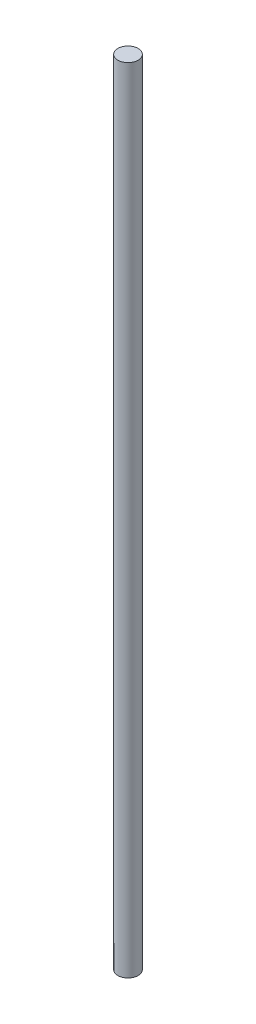
ISO-10303-21;
HEADER;
FILE_DESCRIPTION(('STEP AP214'),'2;1');
FILE_NAME('part.step','',(''),(''),'','','');
FILE_SCHEMA(('AUTOMOTIVE_DESIGN { 1 0 10303 214 1 1 1 1 }'));
ENDSEC;
DATA;
#1=APPLICATION_CONTEXT('core data for automotive mechanical design processes');
#2=APPLICATION_PROTOCOL_DEFINITION('international standard','automotive_design',2000,#1);
#3=PRODUCT_CONTEXT('',#1,'mechanical');
#4=PRODUCT('Part','Part','',(#3));
#5=PRODUCT_RELATED_PRODUCT_CATEGORY('part','',(#4));
#6=PRODUCT_DEFINITION_FORMATION('','',#4);
#7=PRODUCT_DEFINITION_CONTEXT('part definition',#1,'design');
#8=PRODUCT_DEFINITION('design','',#6,#7);
#9=PRODUCT_DEFINITION_SHAPE('','',#8);
#10=(LENGTH_UNIT() NAMED_UNIT(*) SI_UNIT(.MILLI.,.METRE.));
#11=(NAMED_UNIT(*) PLANE_ANGLE_UNIT() SI_UNIT($,.RADIAN.));
#12=(NAMED_UNIT(*) SI_UNIT($,.STERADIAN.) SOLID_ANGLE_UNIT());
#13=UNCERTAINTY_MEASURE_WITH_UNIT(LENGTH_MEASURE(1.E-05),#10,'distance_accuracy_value','');
#14=(GEOMETRIC_REPRESENTATION_CONTEXT(3) GLOBAL_UNCERTAINTY_ASSIGNED_CONTEXT((#13)) GLOBAL_UNIT_ASSIGNED_CONTEXT((#10,
#11,#12)) REPRESENTATION_CONTEXT('',''));
#15=CARTESIAN_POINT('',(0.,0.,0.));
#16=DIRECTION('',(0.,0.,1.));
#17=DIRECTION('',(1.,0.,0.));
#18=AXIS2_PLACEMENT_3D('',#15,#16,#17);
#19=CARTESIAN_POINT('',(0.,156.,0.));
#20=DIRECTION('',(0.,-1.,0.));
#21=DIRECTION('',(0.,0.,-1.));
#22=AXIS2_PLACEMENT_3D('',#19,#20,#21);
#23=CYLINDRICAL_SURFACE('',#22,4.);
#24=CARTESIAN_POINT('',(0.,156.,0.));
#25=DIRECTION('',(0.,1.,0.));
#26=DIRECTION('',(0.,0.,1.));
#27=AXIS2_PLACEMENT_3D('',#24,#25,#26);
#28=CIRCLE('',#27,4.);
#29=CARTESIAN_POINT('',(0.,156.,4.));
#30=VERTEX_POINT('',#29);
#31=EDGE_CURVE('E10',#30,#30,#28,.T.);
#32=ORIENTED_EDGE('',*,*,#31,.F.);
#33=EDGE_LOOP('',(#32));
#34=FACE_BOUND('',#33,.T.);
#35=CARTESIAN_POINT('',(0.,-156.,0.));
#36=DIRECTION('',(0.,1.,0.));
#37=DIRECTION('',(0.,0.,1.));
#38=AXIS2_PLACEMENT_3D('',#35,#36,#37);
#39=CIRCLE('',#38,4.);
#40=CARTESIAN_POINT('',(0.,-156.,4.));
#41=VERTEX_POINT('',#40);
#42=EDGE_CURVE('E18',#41,#41,#39,.T.);
#43=ORIENTED_EDGE('',*,*,#42,.T.);
#44=EDGE_LOOP('',(#43));
#45=FACE_BOUND('',#44,.T.);
#46=ADVANCED_FACE('F15',(#34,#45),#23,.T.);
#47=CARTESIAN_POINT('',(0.,156.,0.));
#48=DIRECTION('',(0.,1.,0.));
#49=DIRECTION('',(0.,0.,1.));
#50=AXIS2_PLACEMENT_3D('',#47,#48,#49);
#51=PLANE('',#50);
#52=ORIENTED_EDGE('',*,*,#31,.T.);
#53=EDGE_LOOP('',(#52));
#54=FACE_BOUND('',#53,.T.);
#55=ADVANCED_FACE('F30',(#54),#51,.T.);
#56=CARTESIAN_POINT('',(0.,-156.,0.));
#57=DIRECTION('',(0.,1.,0.));
#58=DIRECTION('',(0.,0.,1.));
#59=AXIS2_PLACEMENT_3D('',#56,#57,#58);
#60=PLANE('',#59);
#61=ORIENTED_EDGE('',*,*,#42,.F.);
#62=EDGE_LOOP('',(#61));
#63=FACE_BOUND('',#62,.T.);
#64=ADVANCED_FACE('F28',(#63),#60,.F.);
#65=CLOSED_SHELL('',(#46,#55,#64));
#66=MANIFOLD_SOLID_BREP('B1',#65);
#67=ADVANCED_BREP_SHAPE_REPRESENTATION('',(#18,#66),#14);
#68=SHAPE_DEFINITION_REPRESENTATION(#9,#67);
ENDSEC;
END-ISO-10303-21;
